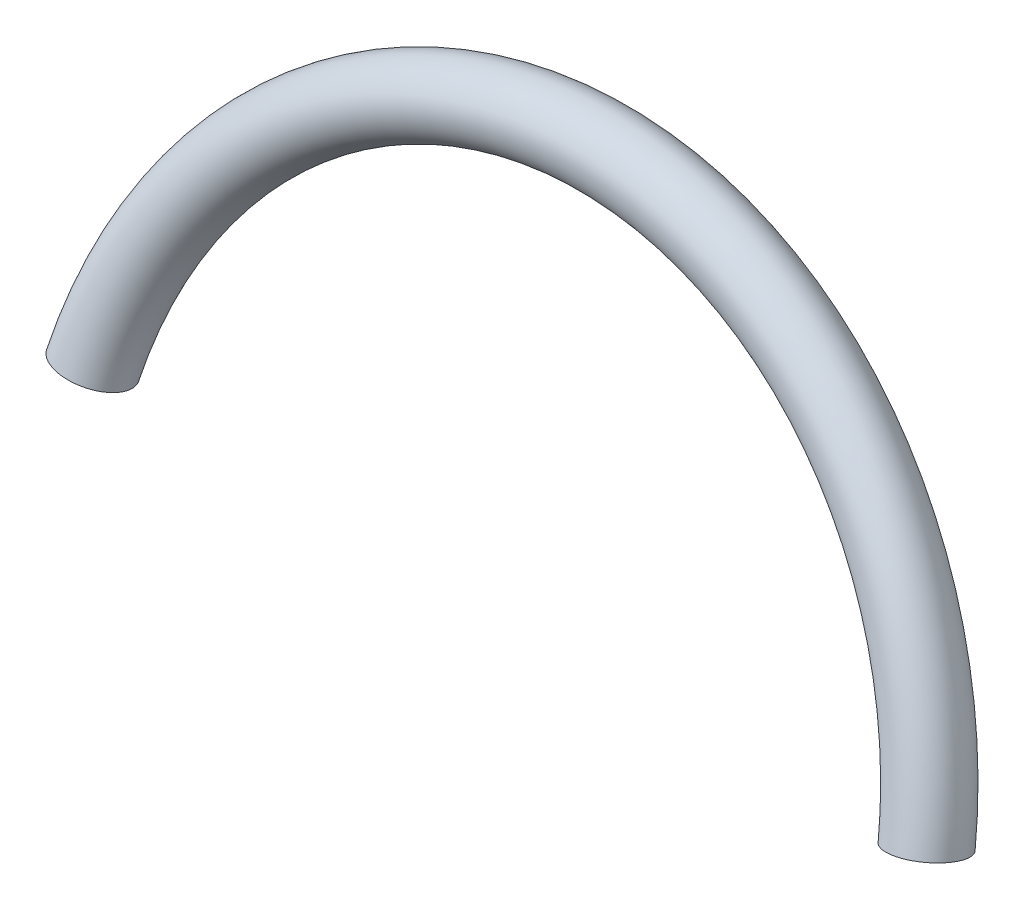
ISO-10303-21;
HEADER;
FILE_DESCRIPTION(('STEP AP214'),'2;1');
FILE_NAME('part.step','',(''),(''),'','','');
FILE_SCHEMA(('AUTOMOTIVE_DESIGN { 1 0 10303 214 1 1 1 1 }'));
ENDSEC;
DATA;
#1=APPLICATION_CONTEXT('core data for automotive mechanical design processes');
#2=APPLICATION_PROTOCOL_DEFINITION('international standard','automotive_design',2000,#1);
#3=PRODUCT_CONTEXT('',#1,'mechanical');
#4=PRODUCT('Part','Part','',(#3));
#5=PRODUCT_RELATED_PRODUCT_CATEGORY('part','',(#4));
#6=PRODUCT_DEFINITION_FORMATION('','',#4);
#7=PRODUCT_DEFINITION_CONTEXT('part definition',#1,'design');
#8=PRODUCT_DEFINITION('design','',#6,#7);
#9=PRODUCT_DEFINITION_SHAPE('','',#8);
#10=(LENGTH_UNIT() NAMED_UNIT(*) SI_UNIT(.MILLI.,.METRE.));
#11=(NAMED_UNIT(*) PLANE_ANGLE_UNIT() SI_UNIT($,.RADIAN.));
#12=(NAMED_UNIT(*) SI_UNIT($,.STERADIAN.) SOLID_ANGLE_UNIT());
#13=UNCERTAINTY_MEASURE_WITH_UNIT(LENGTH_MEASURE(1.E-05),#10,'distance_accuracy_value','');
#14=(GEOMETRIC_REPRESENTATION_CONTEXT(3) GLOBAL_UNCERTAINTY_ASSIGNED_CONTEXT((#13)) GLOBAL_UNIT_ASSIGNED_CONTEXT((#10,
#11,#12)) REPRESENTATION_CONTEXT('',''));
#15=CARTESIAN_POINT('',(0.,0.,0.));
#16=DIRECTION('',(0.,0.,1.));
#17=DIRECTION('',(1.,0.,0.));
#18=AXIS2_PLACEMENT_3D('',#15,#16,#17);
#19=CARTESIAN_POINT('',(0.,904.255410655569,-1942.29450703663));
#20=DIRECTION('',(0.,-0.258819045102518,-0.965925826289069));
#21=DIRECTION('',(0.,0.965925826289069,-0.258819045102518));
#22=AXIS2_PLACEMENT_3D('',#19,#20,#21);
#23=TOROIDAL_SURFACE('',#22,116.149429379517,7.90000000000002);
#24=CARTESIAN_POINT('',(-115.,920.,-1946.51325703663));
#25=DIRECTION('',(-0.140336447675245,-0.956366902675757,0.25625773923976));
#26=DIRECTION('',(0.,-0.258819045102461,-0.965925826289084));
#27=AXIS2_PLACEMENT_3D('',#24,#25,#26);
#28=CIRCLE('',#27,7.90000000000002);
#29=CARTESIAN_POINT('',(-122.821820605175,921.070881333516,-1946.80019882513));
#30=VERTEX_POINT('',#29);
#31=EDGE_CURVE('E47',#30,#30,#28,.T.);
#32=CARTESIAN_POINT('',(115.,920.,-1946.51325703663));
#33=DIRECTION('',(0.140336447675245,-0.956366902675727,0.256257739239872));
#34=DIRECTION('',(0.,-0.258819045102574,-0.965925826289054));
#35=AXIS2_PLACEMENT_3D('',#32,#33,#34);
#36=CIRCLE('',#35,7.90000000000002);
#37=CARTESIAN_POINT('',(122.821820605175,921.070881333516,-1946.80019882513));
#38=VERTEX_POINT('',#37);
#39=EDGE_CURVE('E10',#38,#38,#36,.T.);
#40=CARTESIAN_POINT('',(0.,904.255410655569,-1942.29450703663));
#41=DIRECTION('',(0.,-0.258819045102518,-0.965925826289069));
#42=DIRECTION('',(0.,0.965925826289069,-0.258819045102518));
#43=AXIS2_PLACEMENT_3D('',#40,#41,#42);
#44=CIRCLE('',#43,124.049429379517);
#45=EDGE_CURVE('',#30,#38,#44,.T.);
#46=ORIENTED_EDGE('',*,*,#31,.T.);
#47=ORIENTED_EDGE('',*,*,#39,.T.);
#48=ORIENTED_EDGE('',*,*,#45,.T.);
#49=ORIENTED_EDGE('',*,*,#45,.F.);
#50=EDGE_LOOP('',(#46,#48,#47,#49));
#51=FACE_BOUND('',#50,.T.);
#52=ADVANCED_FACE('F37',(#51),#23,.F.);
#53=CARTESIAN_POINT('',(115.,920.,-1946.51325703663));
#54=DIRECTION('',(0.140336447675245,-0.956366902675727,0.256257739239872));
#55=DIRECTION('',(0.,-0.258819045102574,-0.965925826289054));
#56=AXIS2_PLACEMENT_3D('',#53,#54,#55);
#57=PLANE('',#56);
#58=ORIENTED_EDGE('',*,*,#39,.F.);
#59=EDGE_LOOP('',(#58));
#60=FACE_BOUND('',#59,.T.);
#61=CARTESIAN_POINT('',(115.,920.,-1946.51325703663));
#62=DIRECTION('',(0.140336447675245,-0.956366902675727,0.256257739239872));
#63=DIRECTION('',(0.,-0.258819045102574,-0.965925826289054));
#64=AXIS2_PLACEMENT_3D('',#61,#62,#63);
#65=CIRCLE('',#64,9.49999999999999);
#66=CARTESIAN_POINT('',(124.405986803691,921.287768692202,-1946.85831361774));
#67=VERTEX_POINT('',#66);
#68=EDGE_CURVE('E43',#67,#67,#65,.F.);
#69=ORIENTED_EDGE('',*,*,#68,.F.);
#70=EDGE_LOOP('',(#69));
#71=FACE_BOUND('',#70,.T.);
#72=ADVANCED_FACE('F67',(#60,#71),#57,.T.);
#73=CARTESIAN_POINT('',(0.,904.255410655569,-1942.29450703663));
#74=DIRECTION('',(0.,-0.258819045102518,-0.965925826289069));
#75=DIRECTION('',(0.,0.965925826289069,-0.258819045102518));
#76=AXIS2_PLACEMENT_3D('',#73,#74,#75);
#77=TOROIDAL_SURFACE('',#76,116.149429379517,9.49999999999999);
#78=CARTESIAN_POINT('',(-115.,920.,-1946.51325703663));
#79=DIRECTION('',(-0.140336447675245,-0.956366902675757,0.25625773923976));
#80=DIRECTION('',(0.,-0.258819045102461,-0.965925826289084));
#81=AXIS2_PLACEMENT_3D('',#78,#79,#80);
#82=CIRCLE('',#81,9.49999999999999);
#83=CARTESIAN_POINT('',(-124.405986803691,921.287768692202,-1946.85831361774));
#84=VERTEX_POINT('',#83);
#85=EDGE_CURVE('E51',#84,#84,#82,.F.);
#86=CARTESIAN_POINT('',(0.,904.255410655569,-1942.29450703663));
#87=DIRECTION('',(0.,-0.258819045102518,-0.965925826289069));
#88=DIRECTION('',(0.,0.965925826289069,-0.258819045102518));
#89=AXIS2_PLACEMENT_3D('',#86,#87,#88);
#90=CIRCLE('',#89,125.649429379517);
#91=EDGE_CURVE('',#84,#67,#90,.T.);
#92=ORIENTED_EDGE('',*,*,#85,.T.);
#93=ORIENTED_EDGE('',*,*,#68,.T.);
#94=ORIENTED_EDGE('',*,*,#91,.T.);
#95=ORIENTED_EDGE('',*,*,#91,.F.);
#96=EDGE_LOOP('',(#92,#94,#93,#95));
#97=FACE_BOUND('',#96,.T.);
#98=ADVANCED_FACE('F57',(#97),#77,.T.);
#99=CARTESIAN_POINT('',(-115.,920.,-1946.51325703663));
#100=DIRECTION('',(-0.140336447675245,-0.956366902675757,0.25625773923976));
#101=DIRECTION('',(0.,-0.258819045102461,-0.965925826289084));
#102=AXIS2_PLACEMENT_3D('',#99,#100,#101);
#103=PLANE('',#102);
#104=ORIENTED_EDGE('',*,*,#31,.F.);
#105=EDGE_LOOP('',(#104));
#106=FACE_BOUND('',#105,.T.);
#107=ORIENTED_EDGE('',*,*,#85,.F.);
#108=EDGE_LOOP('',(#107));
#109=FACE_BOUND('',#108,.T.);
#110=ADVANCED_FACE('F59',(#106,#109),#103,.T.);
#111=CLOSED_SHELL('',(#52,#72,#98,#110));
#112=MANIFOLD_SOLID_BREP('B2',#111);
#113=ADVANCED_BREP_SHAPE_REPRESENTATION('',(#18,#112),#14);
#114=SHAPE_DEFINITION_REPRESENTATION(#9,#113);
ENDSEC;
END-ISO-10303-21;
